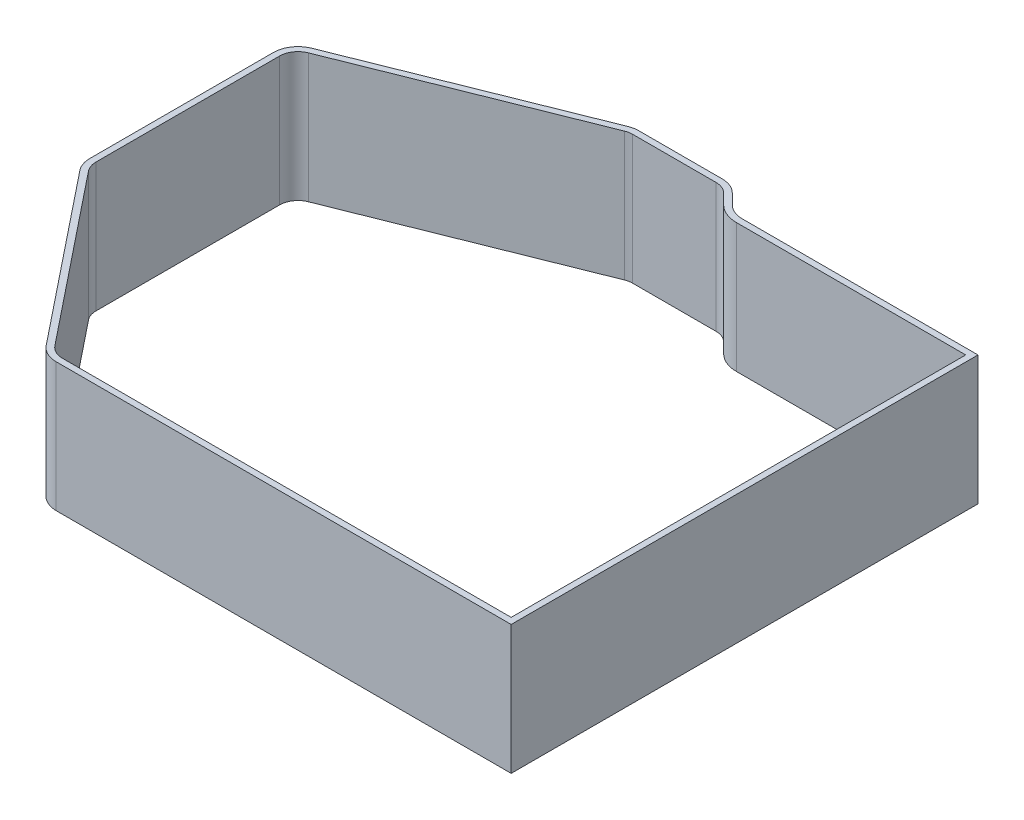
ISO-10303-21;
HEADER;
FILE_DESCRIPTION(('STEP AP214'),'2;1');
FILE_NAME('part.step','',(''),(''),'','','');
FILE_SCHEMA(('AUTOMOTIVE_DESIGN { 1 0 10303 214 1 1 1 1 }'));
ENDSEC;
DATA;
#1=APPLICATION_CONTEXT('core data for automotive mechanical design processes');
#2=APPLICATION_PROTOCOL_DEFINITION('international standard','automotive_design',2000,#1);
#3=PRODUCT_CONTEXT('',#1,'mechanical');
#4=PRODUCT('Part','Part','',(#3));
#5=PRODUCT_RELATED_PRODUCT_CATEGORY('part','',(#4));
#6=PRODUCT_DEFINITION_FORMATION('','',#4);
#7=PRODUCT_DEFINITION_CONTEXT('part definition',#1,'design');
#8=PRODUCT_DEFINITION('design','',#6,#7);
#9=PRODUCT_DEFINITION_SHAPE('','',#8);
#10=(LENGTH_UNIT() NAMED_UNIT(*) SI_UNIT(.MILLI.,.METRE.));
#11=(NAMED_UNIT(*) PLANE_ANGLE_UNIT() SI_UNIT($,.RADIAN.));
#12=(NAMED_UNIT(*) SI_UNIT($,.STERADIAN.) SOLID_ANGLE_UNIT());
#13=UNCERTAINTY_MEASURE_WITH_UNIT(LENGTH_MEASURE(1.E-05),#10,'distance_accuracy_value','');
#14=(GEOMETRIC_REPRESENTATION_CONTEXT(3) GLOBAL_UNCERTAINTY_ASSIGNED_CONTEXT((#13)) GLOBAL_UNIT_ASSIGNED_CONTEXT((#10,
#11,#12)) REPRESENTATION_CONTEXT('',''));
#15=CARTESIAN_POINT('',(0.,0.,0.));
#16=DIRECTION('',(0.,0.,1.));
#17=DIRECTION('',(1.,0.,0.));
#18=AXIS2_PLACEMENT_3D('',#15,#16,#17);
#19=CARTESIAN_POINT('',(1564.01878353652,2112.02129953211,42.7287277412105));
#20=DIRECTION('',(0.,1.,0.));
#21=DIRECTION('',(-1.,0.,0.));
#22=AXIS2_PLACEMENT_3D('',#19,#20,#21);
#23=PLANE('',#22);
#24=CARTESIAN_POINT('',(1564.01878353652,2112.02129953211,42.7287277412105));
#25=DIRECTION('',(0.,1.,0.));
#26=DIRECTION('',(-1.,0.,0.));
#27=AXIS2_PLACEMENT_3D('',#24,#25,#26);
#28=CIRCLE('',#27,1.99999999999854);
#29=CARTESIAN_POINT('',(1562.60456997414,2112.02129953211,44.142941303582));
#30=VERTEX_POINT('',#29);
#31=CARTESIAN_POINT('',(1564.01878353652,2112.02129953211,44.728727741209));
#32=VERTEX_POINT('',#31);
#33=EDGE_CURVE('E410',#30,#32,#28,.T.);
#34=ORIENTED_EDGE('',*,*,#33,.F.);
#35=DIRECTION('',(0.707106781186586,0.,0.707106781186509));
#36=VECTOR('',#35,1.);
#37=CARTESIAN_POINT('',(1561.7761428494,2112.02129953211,43.3145141788359));
#38=LINE('',#37,#36);
#39=CARTESIAN_POINT('',(1561.7761428494,2112.02129953211,43.3145141788358));
#40=VERTEX_POINT('',#39);
#41=EDGE_CURVE('E540',#40,#30,#38,.T.);
#42=ORIENTED_EDGE('',*,*,#41,.F.);
#43=CARTESIAN_POINT('',(1560.36192928702,2112.02129953211,44.7287277412084));
#44=DIRECTION('',(0.,1.,0.));
#45=DIRECTION('',(-1.,0.,0.));
#46=AXIS2_PLACEMENT_3D('',#43,#44,#45);
#47=CIRCLE('',#46,1.99999999999944);
#48=CARTESIAN_POINT('',(1560.36192928702,2112.02129953211,42.7287277412089));
#49=VERTEX_POINT('',#48);
#50=EDGE_CURVE('E414',#40,#49,#47,.T.);
#51=ORIENTED_EDGE('',*,*,#50,.T.);
#52=DIRECTION('',(1.,0.,0.));
#53=VECTOR('',#52,1.);
#54=CARTESIAN_POINT('',(1553.5755212189,2112.02129953211,42.7287277412089));
#55=LINE('',#54,#53);
#56=CARTESIAN_POINT('',(1553.5755212189,2112.02129953211,42.7287277412089));
#57=VERTEX_POINT('',#56);
#58=EDGE_CURVE('E565',#57,#49,#55,.T.);
#59=ORIENTED_EDGE('',*,*,#58,.F.);
#60=CARTESIAN_POINT('',(1553.5755212189,2112.02129953211,44.7287277412074));
#61=DIRECTION('',(0.,-1.,0.));
#62=DIRECTION('',(1.,0.,0.));
#63=AXIS2_PLACEMENT_3D('',#60,#61,#62);
#64=CIRCLE('',#63,1.99999999999848);
#65=CARTESIAN_POINT('',(1552.8327398662,2112.02129953211,42.8717743594383));
#66=VERTEX_POINT('',#65);
#67=EDGE_CURVE('E570',#66,#57,#64,.T.);
#68=ORIENTED_EDGE('',*,*,#67,.F.);
#69=DIRECTION('',(0.928476690885266,0.,-0.371390676354086));
#70=VECTOR('',#69,1.);
#71=CARTESIAN_POINT('',(1534.44757505906,2112.02129953211,50.2258402822917));
#72=LINE('',#71,#70);
#73=CARTESIAN_POINT('',(1534.44757505906,2112.02129953211,50.2258402822917));
#74=VERTEX_POINT('',#73);
#75=EDGE_CURVE('E575',#74,#66,#72,.T.);
#76=ORIENTED_EDGE('',*,*,#75,.F.);
#77=CARTESIAN_POINT('',(1535.19035641177,2112.02129953211,52.0827936640629));
#78=DIRECTION('',(0.,-1.,0.));
#79=DIRECTION('',(1.,0.,0.));
#80=AXIS2_PLACEMENT_3D('',#77,#78,#79);
#81=CIRCLE('',#80,2.00000000000108);
#82=CARTESIAN_POINT('',(1533.19035641177,2112.02129953211,52.0827936640623));
#83=VERTEX_POINT('',#82);
#84=EDGE_CURVE('E580',#83,#74,#81,.T.);
#85=ORIENTED_EDGE('',*,*,#84,.F.);
#86=DIRECTION('',(0.,0.,-1.));
#87=VECTOR('',#86,1.);
#88=CARTESIAN_POINT('',(1533.19035641177,2112.02129953211,67.027165622492));
#89=LINE('',#88,#87);
#90=CARTESIAN_POINT('',(1533.19035641177,2112.02129953211,67.027165622492));
#91=VERTEX_POINT('',#90);
#92=EDGE_CURVE('E585',#91,#83,#89,.T.);
#93=ORIENTED_EDGE('',*,*,#92,.F.);
#94=CARTESIAN_POINT('',(1535.19035641177,2112.02129953211,67.0271656224922));
#95=DIRECTION('',(0.,-1.,0.));
#96=DIRECTION('',(1.,0.,0.));
#97=AXIS2_PLACEMENT_3D('',#94,#95,#96);
#98=CIRCLE('',#97,1.99999999999956);
#99=CARTESIAN_POINT('',(1533.62861879288,2112.02129953211,68.2765557176009));
#100=VERTEX_POINT('',#99);
#101=EDGE_CURVE('E590',#100,#91,#98,.T.);
#102=ORIENTED_EDGE('',*,*,#101,.F.);
#103=DIRECTION('',(-0.624695047554412,0.,-0.780868809443041));
#104=VECTOR('',#103,1.);
#105=CARTESIAN_POINT('',(1544.58986848786,2112.02129953211,81.9781178363175));
#106=LINE('',#105,#104);
#107=CARTESIAN_POINT('',(1544.58986848786,2112.02129953211,81.9781178363175));
#108=VERTEX_POINT('',#107);
#109=EDGE_CURVE('E595',#108,#100,#106,.T.);
#110=ORIENTED_EDGE('',*,*,#109,.F.);
#111=CARTESIAN_POINT('',(1546.15160610674,2112.02129953211,80.7287277412086));
#112=DIRECTION('',(0.,-1.,0.));
#113=DIRECTION('',(1.,0.,0.));
#114=AXIS2_PLACEMENT_3D('',#111,#112,#113);
#115=CIRCLE('',#114,2.00000000000006);
#116=CARTESIAN_POINT('',(1546.15160610674,2112.02129953211,82.7287277412087));
#117=VERTEX_POINT('',#116);
#118=EDGE_CURVE('E600',#117,#108,#115,.T.);
#119=ORIENTED_EDGE('',*,*,#118,.F.);
#120=DIRECTION('',(-1.,0.,0.));
#121=VECTOR('',#120,1.);
#122=CARTESIAN_POINT('',(1583.19035641177,2112.02129953211,82.7287277412096));
#123=LINE('',#122,#121);
#124=CARTESIAN_POINT('',(1583.19035641177,2112.02129953211,82.7287277412096));
#125=VERTEX_POINT('',#124);
#126=EDGE_CURVE('E605',#125,#117,#123,.T.);
#127=ORIENTED_EDGE('',*,*,#126,.F.);
#128=DIRECTION('',(0.,0.,1.));
#129=VECTOR('',#128,1.);
#130=CARTESIAN_POINT('',(1583.19035641177,2112.02129953211,44.7287277412096));
#131=LINE('',#130,#129);
#132=CARTESIAN_POINT('',(1583.19035641177,2112.02129953211,44.7287277412096));
#133=VERTEX_POINT('',#132);
#134=EDGE_CURVE('E608',#133,#125,#131,.T.);
#135=ORIENTED_EDGE('',*,*,#134,.F.);
#136=DIRECTION('',(1.,0.,0.));
#137=VECTOR('',#136,1.);
#138=CARTESIAN_POINT('',(1564.01878353652,2112.02129953211,44.728727741209));
#139=LINE('',#138,#137);
#140=EDGE_CURVE('E541',#32,#133,#139,.T.);
#141=ORIENTED_EDGE('',*,*,#140,.F.);
#142=EDGE_LOOP('',(#34,#42,#51,#59,#68,#76,#85,#93,#102,#110,#119,#127,#135,#141));
#143=FACE_BOUND('',#142,.T.);
#144=DIRECTION('',(1.,0.,0.));
#145=VECTOR('',#144,1.);
#146=CARTESIAN_POINT('',(1.87587452291795E-11,2112.02129953212,43.2287277412089));
#147=LINE('',#146,#145);
#148=CARTESIAN_POINT('',(1553.5755212189,2112.02129953211,43.2287277412089));
#149=VERTEX_POINT('',#148);
#150=CARTESIAN_POINT('',(1560.36192928702,2112.02129953211,43.2287277412089));
#151=VERTEX_POINT('',#150);
#152=EDGE_CURVE('E340',#149,#151,#147,.T.);
#153=ORIENTED_EDGE('',*,*,#152,.T.);
#154=CARTESIAN_POINT('',(1560.36192928702,2112.02129953211,44.7287277412084));
#155=DIRECTION('',(0.,-1.,0.));
#156=DIRECTION('',(1.,0.,0.));
#157=AXIS2_PLACEMENT_3D('',#154,#155,#156);
#158=CIRCLE('',#157,1.49999999999952);
#159=CARTESIAN_POINT('',(1561.4225894588,2112.02129953211,43.6680675694292));
#160=VERTEX_POINT('',#159);
#161=EDGE_CURVE('E126',#160,#151,#158,.F.);
#162=ORIENTED_EDGE('',*,*,#161,.F.);
#163=DIRECTION('',(0.707106781186696,0.,0.7071067811864));
#164=VECTOR('',#163,1.);
#165=CARTESIAN_POINT('',(758.877260944369,2112.02129953212,-758.877260944668));
#166=LINE('',#165,#164);
#167=CARTESIAN_POINT('',(1562.25101658355,2112.02129953211,44.4964946941746));
#168=VERTEX_POINT('',#167);
#169=EDGE_CURVE('E333',#160,#168,#166,.T.);
#170=ORIENTED_EDGE('',*,*,#169,.T.);
#171=CARTESIAN_POINT('',(1564.01878353652,2112.02129953211,42.7287277412105));
#172=DIRECTION('',(0.,-1.,0.));
#173=DIRECTION('',(1.,0.,0.));
#174=AXIS2_PLACEMENT_3D('',#171,#172,#173);
#175=CIRCLE('',#174,2.49999999999828);
#176=CARTESIAN_POINT('',(1564.01878353652,2112.02129953211,45.2287277412088));
#177=VERTEX_POINT('',#176);
#178=EDGE_CURVE('E339',#168,#177,#175,.F.);
#179=ORIENTED_EDGE('',*,*,#178,.T.);
#180=DIRECTION('',(1.,0.,0.));
#181=VECTOR('',#180,1.);
#182=CARTESIAN_POINT('',(1.87587452291795E-11,2112.02129953212,45.2287277412088));
#183=LINE('',#182,#181);
#184=CARTESIAN_POINT('',(1582.69035641177,2112.02129953211,45.2287277412088));
#185=VERTEX_POINT('',#184);
#186=EDGE_CURVE('E451',#177,#185,#183,.T.);
#187=ORIENTED_EDGE('',*,*,#186,.T.);
#188=DIRECTION('',(0.,0.,1.));
#189=VECTOR('',#188,1.);
#190=CARTESIAN_POINT('',(1582.69035641177,2112.02129953211,0.));
#191=LINE('',#190,#189);
#192=CARTESIAN_POINT('',(1582.69035641177,2112.02129953211,82.2287277412087));
#193=VERTEX_POINT('',#192);
#194=EDGE_CURVE('E447',#185,#193,#191,.T.);
#195=ORIENTED_EDGE('',*,*,#194,.T.);
#196=DIRECTION('',(-1.,0.,0.));
#197=VECTOR('',#196,1.);
#198=CARTESIAN_POINT('',(1.87587452291795E-11,2112.02129953212,82.2287277412087));
#199=LINE('',#198,#197);
#200=CARTESIAN_POINT('',(1546.15160610674,2112.02129953211,82.2287277412087));
#201=VERTEX_POINT('',#200);
#202=EDGE_CURVE('E443',#193,#201,#199,.T.);
#203=ORIENTED_EDGE('',*,*,#202,.T.);
#204=CARTESIAN_POINT('',(1546.15160610674,2112.02129953211,80.7287277412086));
#205=DIRECTION('',(0.,-1.,0.));
#206=DIRECTION('',(1.,0.,0.));
#207=AXIS2_PLACEMENT_3D('',#204,#205,#206);
#208=CIRCLE('',#207,1.5000000000001);
#209=CARTESIAN_POINT('',(1544.98030289258,2112.02129953211,81.6657703125404));
#210=VERTEX_POINT('',#209);
#211=EDGE_CURVE('E439',#201,#210,#208,.T.);
#212=ORIENTED_EDGE('',*,*,#211,.T.);
#213=DIRECTION('',(-0.624695047554411,0.,-0.780868809443041));
#214=VECTOR('',#213,1.);
#215=CARTESIAN_POINT('',(902.224199172316,2112.02129953211,-721.779359337813));
#216=LINE('',#215,#214);
#217=CARTESIAN_POINT('',(1534.0190531976,2112.02129953211,67.9642081938237));
#218=VERTEX_POINT('',#217);
#219=EDGE_CURVE('E435',#210,#218,#216,.T.);
#220=ORIENTED_EDGE('',*,*,#219,.T.);
#221=CARTESIAN_POINT('',(1535.19035641177,2112.02129953211,67.0271656224922));
#222=DIRECTION('',(0.,-1.,0.));
#223=DIRECTION('',(1.,0.,0.));
#224=AXIS2_PLACEMENT_3D('',#221,#222,#223);
#225=CIRCLE('',#224,1.49999999999962);
#226=CARTESIAN_POINT('',(1533.69035641177,2112.02129953211,67.0271656224921));
#227=VERTEX_POINT('',#226);
#228=EDGE_CURVE('E431',#218,#227,#225,.T.);
#229=ORIENTED_EDGE('',*,*,#228,.T.);
#230=DIRECTION('',(0.,0.,-1.));
#231=VECTOR('',#230,1.);
#232=CARTESIAN_POINT('',(1533.69035641177,2112.02129953211,0.));
#233=LINE('',#232,#231);
#234=CARTESIAN_POINT('',(1533.69035641177,2112.02129953211,52.0827936640623));
#235=VERTEX_POINT('',#234);
#236=EDGE_CURVE('E427',#227,#235,#233,.T.);
#237=ORIENTED_EDGE('',*,*,#236,.T.);
#238=CARTESIAN_POINT('',(1535.19035641177,2112.02129953211,52.0827936640629));
#239=DIRECTION('',(0.,-1.,0.));
#240=DIRECTION('',(1.,0.,0.));
#241=AXIS2_PLACEMENT_3D('',#238,#239,#240);
#242=CIRCLE('',#241,1.50000000000154);
#243=CARTESIAN_POINT('',(1534.63327039724,2112.02129953211,50.6900786277338));
#244=VERTEX_POINT('',#243);
#245=EDGE_CURVE('E423',#235,#244,#242,.T.);
#246=ORIENTED_EDGE('',*,*,#245,.T.);
#247=DIRECTION('',(0.928476690885276,0.,-0.371390676354064));
#248=VECTOR('',#247,1.);
#249=CARTESIAN_POINT('',(229.152891995358,2112.02129953212,572.88222998842));
#250=LINE('',#249,#248);
#251=CARTESIAN_POINT('',(1553.01843520437,2112.02129953211,43.3360127048809));
#252=VERTEX_POINT('',#251);
#253=EDGE_CURVE('E419',#244,#252,#250,.T.);
#254=ORIENTED_EDGE('',*,*,#253,.T.);
#255=CARTESIAN_POINT('',(1553.5755212189,2112.02129953211,44.7287277412074));
#256=DIRECTION('',(0.,-1.,0.));
#257=DIRECTION('',(1.,0.,0.));
#258=AXIS2_PLACEMENT_3D('',#255,#256,#257);
#259=CIRCLE('',#258,1.49999999999845);
#260=EDGE_CURVE('E415',#252,#149,#259,.T.);
#261=ORIENTED_EDGE('',*,*,#260,.T.);
#262=EDGE_LOOP('',(#153,#162,#170,#179,#187,#195,#203,#212,#220,#229,#237,#246,#254,#261));
#263=FACE_BOUND('',#262,.T.);
#264=ADVANCED_FACE('F123',(#143,#263),#23,.T.);
#265=CARTESIAN_POINT('',(1564.01878353652,2101.52129953211,42.7287277412105));
#266=DIRECTION('',(0.,1.,0.));
#267=DIRECTION('',(-1.,0.,0.));
#268=AXIS2_PLACEMENT_3D('',#265,#266,#267);
#269=PLANE('',#268);
#270=CARTESIAN_POINT('',(1564.01878353652,2101.52129953211,42.7287277412105));
#271=DIRECTION('',(0.,1.,0.));
#272=DIRECTION('',(-1.,0.,0.));
#273=AXIS2_PLACEMENT_3D('',#270,#271,#272);
#274=CIRCLE('',#273,1.99999999999854);
#275=CARTESIAN_POINT('',(1562.60456997414,2101.52129953211,44.142941303582));
#276=VERTEX_POINT('',#275);
#277=CARTESIAN_POINT('',(1564.01878353652,2101.52129953211,44.728727741209));
#278=VERTEX_POINT('',#277);
#279=EDGE_CURVE('E418',#276,#278,#274,.T.);
#280=ORIENTED_EDGE('',*,*,#279,.T.);
#281=DIRECTION('',(1.,0.,0.));
#282=VECTOR('',#281,1.);
#283=CARTESIAN_POINT('',(1564.01878353652,2101.52129953211,44.728727741209));
#284=LINE('',#283,#282);
#285=CARTESIAN_POINT('',(1583.19035641177,2101.52129953211,44.7287277412096));
#286=VERTEX_POINT('',#285);
#287=EDGE_CURVE('E683',#278,#286,#284,.T.);
#288=ORIENTED_EDGE('',*,*,#287,.T.);
#289=DIRECTION('',(0.,0.,1.));
#290=VECTOR('',#289,1.);
#291=CARTESIAN_POINT('',(1583.19035641177,2101.52129953211,44.7287277412096));
#292=LINE('',#291,#290);
#293=CARTESIAN_POINT('',(1583.19035641177,2101.52129953211,82.7287277412096));
#294=VERTEX_POINT('',#293);
#295=EDGE_CURVE('E680',#286,#294,#292,.T.);
#296=ORIENTED_EDGE('',*,*,#295,.T.);
#297=DIRECTION('',(-1.,0.,0.));
#298=VECTOR('',#297,1.);
#299=CARTESIAN_POINT('',(1583.19035641177,2101.52129953211,82.7287277412096));
#300=LINE('',#299,#298);
#301=CARTESIAN_POINT('',(1546.15160610674,2101.52129953211,82.7287277412087));
#302=VERTEX_POINT('',#301);
#303=EDGE_CURVE('E676',#294,#302,#300,.T.);
#304=ORIENTED_EDGE('',*,*,#303,.T.);
#305=CARTESIAN_POINT('',(1546.15160610674,2101.52129953211,80.7287277412086));
#306=DIRECTION('',(0.,-1.,0.));
#307=DIRECTION('',(1.,0.,0.));
#308=AXIS2_PLACEMENT_3D('',#305,#306,#307);
#309=CIRCLE('',#308,2.00000000000006);
#310=CARTESIAN_POINT('',(1544.58986848786,2101.52129953211,81.9781178363175));
#311=VERTEX_POINT('',#310);
#312=EDGE_CURVE('E672',#302,#311,#309,.T.);
#313=ORIENTED_EDGE('',*,*,#312,.T.);
#314=DIRECTION('',(-0.624695047554412,0.,-0.780868809443041));
#315=VECTOR('',#314,1.);
#316=CARTESIAN_POINT('',(1544.58986848786,2101.52129953211,81.9781178363175));
#317=LINE('',#316,#315);
#318=CARTESIAN_POINT('',(1533.62861879288,2101.52129953211,68.2765557176009));
#319=VERTEX_POINT('',#318);
#320=EDGE_CURVE('E668',#311,#319,#317,.T.);
#321=ORIENTED_EDGE('',*,*,#320,.T.);
#322=CARTESIAN_POINT('',(1535.19035641177,2101.52129953211,67.0271656224922));
#323=DIRECTION('',(0.,-1.,0.));
#324=DIRECTION('',(1.,0.,0.));
#325=AXIS2_PLACEMENT_3D('',#322,#323,#324);
#326=CIRCLE('',#325,1.99999999999956);
#327=CARTESIAN_POINT('',(1533.19035641177,2101.52129953211,67.027165622492));
#328=VERTEX_POINT('',#327);
#329=EDGE_CURVE('E664',#319,#328,#326,.T.);
#330=ORIENTED_EDGE('',*,*,#329,.T.);
#331=DIRECTION('',(0.,0.,-1.));
#332=VECTOR('',#331,1.);
#333=CARTESIAN_POINT('',(1533.19035641177,2101.52129953211,67.027165622492));
#334=LINE('',#333,#332);
#335=CARTESIAN_POINT('',(1533.19035641177,2101.52129953211,52.0827936640623));
#336=VERTEX_POINT('',#335);
#337=EDGE_CURVE('E660',#328,#336,#334,.T.);
#338=ORIENTED_EDGE('',*,*,#337,.T.);
#339=CARTESIAN_POINT('',(1535.19035641177,2101.52129953211,52.0827936640629));
#340=DIRECTION('',(0.,-1.,0.));
#341=DIRECTION('',(1.,0.,0.));
#342=AXIS2_PLACEMENT_3D('',#339,#340,#341);
#343=CIRCLE('',#342,2.00000000000108);
#344=CARTESIAN_POINT('',(1534.44757505906,2101.52129953211,50.2258402822917));
#345=VERTEX_POINT('',#344);
#346=EDGE_CURVE('E656',#336,#345,#343,.T.);
#347=ORIENTED_EDGE('',*,*,#346,.T.);
#348=DIRECTION('',(0.928476690885266,0.,-0.371390676354086));
#349=VECTOR('',#348,1.);
#350=CARTESIAN_POINT('',(1534.44757505906,2101.52129953211,50.2258402822917));
#351=LINE('',#350,#349);
#352=CARTESIAN_POINT('',(1552.8327398662,2101.52129953211,42.8717743594383));
#353=VERTEX_POINT('',#352);
#354=EDGE_CURVE('E652',#345,#353,#351,.T.);
#355=ORIENTED_EDGE('',*,*,#354,.T.);
#356=CARTESIAN_POINT('',(1553.5755212189,2101.52129953211,44.7287277412074));
#357=DIRECTION('',(0.,-1.,0.));
#358=DIRECTION('',(1.,0.,0.));
#359=AXIS2_PLACEMENT_3D('',#356,#357,#358);
#360=CIRCLE('',#359,1.99999999999848);
#361=CARTESIAN_POINT('',(1553.5755212189,2101.52129953211,42.7287277412089));
#362=VERTEX_POINT('',#361);
#363=EDGE_CURVE('E648',#353,#362,#360,.T.);
#364=ORIENTED_EDGE('',*,*,#363,.T.);
#365=DIRECTION('',(1.,0.,0.));
#366=VECTOR('',#365,1.);
#367=CARTESIAN_POINT('',(1553.5755212189,2101.52129953211,42.7287277412089));
#368=LINE('',#367,#366);
#369=CARTESIAN_POINT('',(1560.36192928702,2101.52129953211,42.7287277412089));
#370=VERTEX_POINT('',#369);
#371=EDGE_CURVE('E641',#362,#370,#368,.T.);
#372=ORIENTED_EDGE('',*,*,#371,.T.);
#373=CARTESIAN_POINT('',(1560.36192928702,2101.52129953211,44.7287277412084));
#374=DIRECTION('',(0.,1.,0.));
#375=DIRECTION('',(-1.,0.,0.));
#376=AXIS2_PLACEMENT_3D('',#373,#374,#375);
#377=CIRCLE('',#376,1.99999999999944);
#378=CARTESIAN_POINT('',(1561.7761428494,2101.52129953211,43.3145141788358));
#379=VERTEX_POINT('',#378);
#380=EDGE_CURVE('E557',#379,#370,#377,.T.);
#381=ORIENTED_EDGE('',*,*,#380,.F.);
#382=DIRECTION('',(0.707106781186586,0.,0.707106781186509));
#383=VECTOR('',#382,1.);
#384=CARTESIAN_POINT('',(1561.7761428494,2101.52129953211,43.3145141788359));
#385=LINE('',#384,#383);
#386=EDGE_CURVE('E411',#379,#276,#385,.T.);
#387=ORIENTED_EDGE('',*,*,#386,.T.);
#388=EDGE_LOOP('',(#280,#288,#296,#304,#313,#321,#330,#338,#347,#355,#364,#372,#381,#387));
#389=FACE_BOUND('',#388,.T.);
#390=CARTESIAN_POINT('',(1560.36192928702,2101.52129953211,44.7287277412084));
#391=DIRECTION('',(0.,-1.,0.));
#392=DIRECTION('',(1.,0.,0.));
#393=AXIS2_PLACEMENT_3D('',#390,#391,#392);
#394=CIRCLE('',#393,1.49999999999952);
#395=CARTESIAN_POINT('',(1561.4225894588,2101.52129953211,43.6680675694293));
#396=VERTEX_POINT('',#395);
#397=CARTESIAN_POINT('',(1560.36192928702,2101.52129953211,43.2287277412089));
#398=VERTEX_POINT('',#397);
#399=EDGE_CURVE('E318',#396,#398,#394,.F.);
#400=ORIENTED_EDGE('',*,*,#399,.T.);
#401=DIRECTION('',(1.,0.,0.));
#402=VECTOR('',#401,1.);
#403=CARTESIAN_POINT('',(1.86854241210638E-11,2101.52129953212,43.2287277412089));
#404=LINE('',#403,#402);
#405=CARTESIAN_POINT('',(1553.5755212189,2101.52129953211,43.2287277412089));
#406=VERTEX_POINT('',#405);
#407=EDGE_CURVE('E347',#406,#398,#404,.T.);
#408=ORIENTED_EDGE('',*,*,#407,.F.);
#409=CARTESIAN_POINT('',(1553.5755212189,2101.52129953211,44.7287277412074));
#410=DIRECTION('',(0.,-1.,0.));
#411=DIRECTION('',(1.,0.,0.));
#412=AXIS2_PLACEMENT_3D('',#409,#410,#411);
#413=CIRCLE('',#412,1.49999999999845);
#414=CARTESIAN_POINT('',(1553.01843520437,2101.52129953211,43.3360127048809));
#415=VERTEX_POINT('',#414);
#416=EDGE_CURVE('E357',#415,#406,#413,.T.);
#417=ORIENTED_EDGE('',*,*,#416,.F.);
#418=DIRECTION('',(0.928476690885276,0.,-0.371390676354064));
#419=VECTOR('',#418,1.);
#420=CARTESIAN_POINT('',(229.152891995358,2101.52129953212,572.88222998842));
#421=LINE('',#420,#419);
#422=CARTESIAN_POINT('',(1534.63327039724,2101.52129953211,50.6900786277338));
#423=VERTEX_POINT('',#422);
#424=EDGE_CURVE('E361',#423,#415,#421,.T.);
#425=ORIENTED_EDGE('',*,*,#424,.F.);
#426=CARTESIAN_POINT('',(1535.19035641177,2101.52129953211,52.0827936640629));
#427=DIRECTION('',(0.,-1.,0.));
#428=DIRECTION('',(1.,0.,0.));
#429=AXIS2_PLACEMENT_3D('',#426,#427,#428);
#430=CIRCLE('',#429,1.50000000000154);
#431=CARTESIAN_POINT('',(1533.69035641177,2101.52129953211,52.0827936640623));
#432=VERTEX_POINT('',#431);
#433=EDGE_CURVE('E366',#432,#423,#430,.T.);
#434=ORIENTED_EDGE('',*,*,#433,.F.);
#435=DIRECTION('',(0.,0.,-1.));
#436=VECTOR('',#435,1.);
#437=CARTESIAN_POINT('',(1533.69035641177,2101.52129953211,0.));
#438=LINE('',#437,#436);
#439=CARTESIAN_POINT('',(1533.69035641177,2101.52129953211,67.0271656224921));
#440=VERTEX_POINT('',#439);
#441=EDGE_CURVE('E371',#440,#432,#438,.T.);
#442=ORIENTED_EDGE('',*,*,#441,.F.);
#443=CARTESIAN_POINT('',(1535.19035641177,2101.52129953211,67.0271656224922));
#444=DIRECTION('',(0.,-1.,0.));
#445=DIRECTION('',(1.,0.,0.));
#446=AXIS2_PLACEMENT_3D('',#443,#444,#445);
#447=CIRCLE('',#446,1.49999999999962);
#448=CARTESIAN_POINT('',(1534.0190531976,2101.52129953211,67.9642081938237));
#449=VERTEX_POINT('',#448);
#450=EDGE_CURVE('E376',#449,#440,#447,.T.);
#451=ORIENTED_EDGE('',*,*,#450,.F.);
#452=DIRECTION('',(-0.624695047554411,0.,-0.780868809443041));
#453=VECTOR('',#452,1.);
#454=CARTESIAN_POINT('',(902.224199172316,2101.52129953211,-721.779359337813));
#455=LINE('',#454,#453);
#456=CARTESIAN_POINT('',(1544.98030289258,2101.52129953211,81.6657703125404));
#457=VERTEX_POINT('',#456);
#458=EDGE_CURVE('E381',#457,#449,#455,.T.);
#459=ORIENTED_EDGE('',*,*,#458,.F.);
#460=CARTESIAN_POINT('',(1546.15160610674,2101.52129953211,80.7287277412086));
#461=DIRECTION('',(0.,-1.,0.));
#462=DIRECTION('',(1.,0.,0.));
#463=AXIS2_PLACEMENT_3D('',#460,#461,#462);
#464=CIRCLE('',#463,1.5000000000001);
#465=CARTESIAN_POINT('',(1546.15160610674,2101.52129953211,82.2287277412087));
#466=VERTEX_POINT('',#465);
#467=EDGE_CURVE('E386',#466,#457,#464,.T.);
#468=ORIENTED_EDGE('',*,*,#467,.F.);
#469=DIRECTION('',(-1.,0.,0.));
#470=VECTOR('',#469,1.);
#471=CARTESIAN_POINT('',(1.86854241210638E-11,2101.52129953212,82.2287277412087));
#472=LINE('',#471,#470);
#473=CARTESIAN_POINT('',(1582.69035641177,2101.52129953211,82.2287277412087));
#474=VERTEX_POINT('',#473);
#475=EDGE_CURVE('E391',#474,#466,#472,.T.);
#476=ORIENTED_EDGE('',*,*,#475,.F.);
#477=DIRECTION('',(0.,0.,1.));
#478=VECTOR('',#477,1.);
#479=CARTESIAN_POINT('',(1582.69035641177,2101.52129953211,0.));
#480=LINE('',#479,#478);
#481=CARTESIAN_POINT('',(1582.69035641177,2101.52129953211,45.2287277412088));
#482=VERTEX_POINT('',#481);
#483=EDGE_CURVE('E396',#482,#474,#480,.T.);
#484=ORIENTED_EDGE('',*,*,#483,.F.);
#485=DIRECTION('',(1.,0.,0.));
#486=VECTOR('',#485,1.);
#487=CARTESIAN_POINT('',(1.86854241210638E-11,2101.52129953212,45.2287277412088));
#488=LINE('',#487,#486);
#489=CARTESIAN_POINT('',(1564.01878353652,2101.52129953211,45.2287277412088));
#490=VERTEX_POINT('',#489);
#491=EDGE_CURVE('E400',#490,#482,#488,.T.);
#492=ORIENTED_EDGE('',*,*,#491,.F.);
#493=CARTESIAN_POINT('',(1564.01878353652,2101.52129953211,42.7287277412105));
#494=DIRECTION('',(0.,-1.,0.));
#495=DIRECTION('',(1.,0.,0.));
#496=AXIS2_PLACEMENT_3D('',#493,#494,#495);
#497=CIRCLE('',#496,2.49999999999828);
#498=CARTESIAN_POINT('',(1562.25101658355,2101.52129953211,44.4964946941748));
#499=VERTEX_POINT('',#498);
#500=EDGE_CURVE('E328',#499,#490,#497,.F.);
#501=ORIENTED_EDGE('',*,*,#500,.F.);
#502=DIRECTION('',(0.707106781186696,0.,0.7071067811864));
#503=VECTOR('',#502,1.);
#504=CARTESIAN_POINT('',(758.877260944369,2101.52129953212,-758.877260944668));
#505=LINE('',#504,#503);
#506=EDGE_CURVE('E329',#396,#499,#505,.T.);
#507=ORIENTED_EDGE('',*,*,#506,.F.);
#508=EDGE_LOOP('',(#400,#408,#417,#425,#434,#442,#451,#459,#468,#476,#484,#492,#501,#507));
#509=FACE_BOUND('',#508,.T.);
#510=ADVANCED_FACE('F462',(#389,#509),#269,.F.);
#511=CARTESIAN_POINT('',(1564.01878353652,2112.02129953211,42.7287277412105));
#512=DIRECTION('',(0.,-1.,0.));
#513=DIRECTION('',(1.,0.,0.));
#514=AXIS2_PLACEMENT_3D('',#511,#512,#513);
#515=CYLINDRICAL_SURFACE('',#514,1.99999999999854);
#516=ORIENTED_EDGE('',*,*,#279,.F.);
#517=DIRECTION('',(0.,-1.,0.));
#518=VECTOR('',#517,1.);
#519=CARTESIAN_POINT('',(1562.60456997414,2112.02129953211,44.142941303582));
#520=LINE('',#519,#518);
#521=EDGE_CURVE('E549',#30,#276,#520,.T.);
#522=ORIENTED_EDGE('',*,*,#521,.F.);
#523=ORIENTED_EDGE('',*,*,#33,.T.);
#524=DIRECTION('',(0.,-1.,0.));
#525=VECTOR('',#524,1.);
#526=CARTESIAN_POINT('',(1564.01878353652,2112.02129953211,44.728727741209));
#527=LINE('',#526,#525);
#528=EDGE_CURVE('E544',#32,#278,#527,.T.);
#529=ORIENTED_EDGE('',*,*,#528,.T.);
#530=EDGE_LOOP('',(#516,#522,#523,#529));
#531=FACE_BOUND('',#530,.T.);
#532=ADVANCED_FACE('F533',(#531),#515,.F.);
#533=CARTESIAN_POINT('',(1561.7761428494,2112.02129953211,43.3145141788359));
#534=DIRECTION('',(0.707106781186509,0.,-0.707106781186586));
#535=DIRECTION('',(-0.707106781186586,0.,-0.707106781186509));
#536=AXIS2_PLACEMENT_3D('',#533,#534,#535);
#537=PLANE('',#536);
#538=ORIENTED_EDGE('',*,*,#386,.F.);
#539=DIRECTION('',(0.,-1.,0.));
#540=VECTOR('',#539,1.);
#541=CARTESIAN_POINT('',(1561.7761428494,2112.02129953211,43.3145141788358));
#542=LINE('',#541,#540);
#543=EDGE_CURVE('E551',#40,#379,#542,.T.);
#544=ORIENTED_EDGE('',*,*,#543,.F.);
#545=ORIENTED_EDGE('',*,*,#41,.T.);
#546=ORIENTED_EDGE('',*,*,#521,.T.);
#547=EDGE_LOOP('',(#538,#544,#545,#546));
#548=FACE_BOUND('',#547,.T.);
#549=ADVANCED_FACE('F548',(#548),#537,.T.);
#550=CARTESIAN_POINT('',(1560.36192928702,2112.02129953211,44.7287277412084));
#551=DIRECTION('',(0.,-1.,0.));
#552=DIRECTION('',(1.,0.,0.));
#553=AXIS2_PLACEMENT_3D('',#550,#551,#552);
#554=CYLINDRICAL_SURFACE('',#553,1.99999999999944);
#555=ORIENTED_EDGE('',*,*,#380,.T.);
#556=DIRECTION('',(0.,-1.,0.));
#557=VECTOR('',#556,1.);
#558=CARTESIAN_POINT('',(1560.36192928702,2112.02129953211,42.7287277412089));
#559=LINE('',#558,#557);
#560=EDGE_CURVE('E569',#49,#370,#559,.T.);
#561=ORIENTED_EDGE('',*,*,#560,.F.);
#562=ORIENTED_EDGE('',*,*,#50,.F.);
#563=ORIENTED_EDGE('',*,*,#543,.T.);
#564=EDGE_LOOP('',(#555,#561,#562,#563));
#565=FACE_BOUND('',#564,.T.);
#566=ADVANCED_FACE('F735',(#565),#554,.T.);
#567=CARTESIAN_POINT('',(1553.5755212189,2112.02129953211,42.7287277412089));
#568=DIRECTION('',(0.,0.,-1.));
#569=DIRECTION('',(-1.,0.,0.));
#570=AXIS2_PLACEMENT_3D('',#567,#568,#569);
#571=PLANE('',#570);
#572=ORIENTED_EDGE('',*,*,#371,.F.);
#573=DIRECTION('',(0.,-1.,0.));
#574=VECTOR('',#573,1.);
#575=CARTESIAN_POINT('',(1553.5755212189,2112.02129953211,42.7287277412089));
#576=LINE('',#575,#574);
#577=EDGE_CURVE('E574',#57,#362,#576,.T.);
#578=ORIENTED_EDGE('',*,*,#577,.F.);
#579=ORIENTED_EDGE('',*,*,#58,.T.);
#580=ORIENTED_EDGE('',*,*,#560,.T.);
#581=EDGE_LOOP('',(#572,#578,#579,#580));
#582=FACE_BOUND('',#581,.T.);
#583=ADVANCED_FACE('F731',(#582),#571,.T.);
#584=CARTESIAN_POINT('',(1553.5755212189,2112.02129953211,44.7287277412074));
#585=DIRECTION('',(0.,-1.,0.));
#586=DIRECTION('',(1.,0.,0.));
#587=AXIS2_PLACEMENT_3D('',#584,#585,#586);
#588=CYLINDRICAL_SURFACE('',#587,1.99999999999848);
#589=ORIENTED_EDGE('',*,*,#363,.F.);
#590=DIRECTION('',(0.,-1.,0.));
#591=VECTOR('',#590,1.);
#592=CARTESIAN_POINT('',(1552.8327398662,2112.02129953211,42.8717743594383));
#593=LINE('',#592,#591);
#594=EDGE_CURVE('E579',#66,#353,#593,.T.);
#595=ORIENTED_EDGE('',*,*,#594,.F.);
#596=ORIENTED_EDGE('',*,*,#67,.T.);
#597=ORIENTED_EDGE('',*,*,#577,.T.);
#598=EDGE_LOOP('',(#589,#595,#596,#597));
#599=FACE_BOUND('',#598,.T.);
#600=ADVANCED_FACE('F727',(#599),#588,.T.);
#601=CARTESIAN_POINT('',(1534.44757505906,2112.02129953211,50.2258402822917));
#602=DIRECTION('',(-0.371390676354086,0.,-0.928476690885267));
#603=DIRECTION('',(-0.928476690885267,0.,0.371390676354086));
#604=AXIS2_PLACEMENT_3D('',#601,#602,#603);
#605=PLANE('',#604);
#606=ORIENTED_EDGE('',*,*,#354,.F.);
#607=DIRECTION('',(0.,-1.,0.));
#608=VECTOR('',#607,1.);
#609=CARTESIAN_POINT('',(1534.44757505906,2112.02129953211,50.2258402822917));
#610=LINE('',#609,#608);
#611=EDGE_CURVE('E584',#74,#345,#610,.T.);
#612=ORIENTED_EDGE('',*,*,#611,.F.);
#613=ORIENTED_EDGE('',*,*,#75,.T.);
#614=ORIENTED_EDGE('',*,*,#594,.T.);
#615=EDGE_LOOP('',(#606,#612,#613,#614));
#616=FACE_BOUND('',#615,.T.);
#617=ADVANCED_FACE('F723',(#616),#605,.T.);
#618=CARTESIAN_POINT('',(1535.19035641177,2112.02129953211,52.0827936640629));
#619=DIRECTION('',(0.,-1.,0.));
#620=DIRECTION('',(1.,0.,0.));
#621=AXIS2_PLACEMENT_3D('',#618,#619,#620);
#622=CYLINDRICAL_SURFACE('',#621,2.00000000000108);
#623=ORIENTED_EDGE('',*,*,#346,.F.);
#624=DIRECTION('',(0.,-1.,0.));
#625=VECTOR('',#624,1.);
#626=CARTESIAN_POINT('',(1533.19035641177,2112.02129953211,52.0827936640623));
#627=LINE('',#626,#625);
#628=EDGE_CURVE('E589',#83,#336,#627,.T.);
#629=ORIENTED_EDGE('',*,*,#628,.F.);
#630=ORIENTED_EDGE('',*,*,#84,.T.);
#631=ORIENTED_EDGE('',*,*,#611,.T.);
#632=EDGE_LOOP('',(#623,#629,#630,#631));
#633=FACE_BOUND('',#632,.T.);
#634=ADVANCED_FACE('F719',(#633),#622,.T.);
#635=CARTESIAN_POINT('',(1533.19035641177,2112.02129953211,67.027165622492));
#636=DIRECTION('',(-1.,0.,0.));
#637=DIRECTION('',(0.,0.,1.));
#638=AXIS2_PLACEMENT_3D('',#635,#636,#637);
#639=PLANE('',#638);
#640=ORIENTED_EDGE('',*,*,#337,.F.);
#641=DIRECTION('',(0.,-1.,0.));
#642=VECTOR('',#641,1.);
#643=CARTESIAN_POINT('',(1533.19035641177,2112.02129953211,67.027165622492));
#644=LINE('',#643,#642);
#645=EDGE_CURVE('E594',#91,#328,#644,.T.);
#646=ORIENTED_EDGE('',*,*,#645,.F.);
#647=ORIENTED_EDGE('',*,*,#92,.T.);
#648=ORIENTED_EDGE('',*,*,#628,.T.);
#649=EDGE_LOOP('',(#640,#646,#647,#648));
#650=FACE_BOUND('',#649,.T.);
#651=ADVANCED_FACE('F715',(#650),#639,.T.);
#652=CARTESIAN_POINT('',(1535.19035641177,2112.02129953211,67.0271656224922));
#653=DIRECTION('',(0.,-1.,0.));
#654=DIRECTION('',(1.,0.,0.));
#655=AXIS2_PLACEMENT_3D('',#652,#653,#654);
#656=CYLINDRICAL_SURFACE('',#655,1.99999999999956);
#657=ORIENTED_EDGE('',*,*,#329,.F.);
#658=DIRECTION('',(0.,-1.,0.));
#659=VECTOR('',#658,1.);
#660=CARTESIAN_POINT('',(1533.62861879288,2112.02129953211,68.2765557176009));
#661=LINE('',#660,#659);
#662=EDGE_CURVE('E599',#100,#319,#661,.T.);
#663=ORIENTED_EDGE('',*,*,#662,.F.);
#664=ORIENTED_EDGE('',*,*,#101,.T.);
#665=ORIENTED_EDGE('',*,*,#645,.T.);
#666=EDGE_LOOP('',(#657,#663,#664,#665));
#667=FACE_BOUND('',#666,.T.);
#668=ADVANCED_FACE('F711',(#667),#656,.T.);
#669=CARTESIAN_POINT('',(1544.58986848786,2112.02129953211,81.9781178363175));
#670=DIRECTION('',(-0.780868809443041,0.,0.624695047554412));
#671=DIRECTION('',(0.624695047554412,0.,0.780868809443041));
#672=AXIS2_PLACEMENT_3D('',#669,#670,#671);
#673=PLANE('',#672);
#674=ORIENTED_EDGE('',*,*,#320,.F.);
#675=DIRECTION('',(0.,-1.,0.));
#676=VECTOR('',#675,1.);
#677=CARTESIAN_POINT('',(1544.58986848786,2112.02129953211,81.9781178363175));
#678=LINE('',#677,#676);
#679=EDGE_CURVE('E604',#108,#311,#678,.T.);
#680=ORIENTED_EDGE('',*,*,#679,.F.);
#681=ORIENTED_EDGE('',*,*,#109,.T.);
#682=ORIENTED_EDGE('',*,*,#662,.T.);
#683=EDGE_LOOP('',(#674,#680,#681,#682));
#684=FACE_BOUND('',#683,.T.);
#685=ADVANCED_FACE('F707',(#684),#673,.T.);
#686=CARTESIAN_POINT('',(1546.15160610674,2112.02129953211,80.7287277412086));
#687=DIRECTION('',(0.,-1.,0.));
#688=DIRECTION('',(1.,0.,0.));
#689=AXIS2_PLACEMENT_3D('',#686,#687,#688);
#690=CYLINDRICAL_SURFACE('',#689,2.00000000000006);
#691=ORIENTED_EDGE('',*,*,#312,.F.);
#692=DIRECTION('',(0.,-1.,0.));
#693=VECTOR('',#692,1.);
#694=CARTESIAN_POINT('',(1546.15160610674,2112.02129953211,82.7287277412087));
#695=LINE('',#694,#693);
#696=EDGE_CURVE('E293',#117,#302,#695,.T.);
#697=ORIENTED_EDGE('',*,*,#696,.F.);
#698=ORIENTED_EDGE('',*,*,#118,.T.);
#699=ORIENTED_EDGE('',*,*,#679,.T.);
#700=EDGE_LOOP('',(#691,#697,#698,#699));
#701=FACE_BOUND('',#700,.T.);
#702=ADVANCED_FACE('F704',(#701),#690,.T.);
#703=CARTESIAN_POINT('',(1583.19035641177,2112.02129953211,82.7287277412096));
#704=DIRECTION('',(0.,0.,1.));
#705=DIRECTION('',(1.,0.,0.));
#706=AXIS2_PLACEMENT_3D('',#703,#704,#705);
#707=PLANE('',#706);
#708=ORIENTED_EDGE('',*,*,#303,.F.);
#709=DIRECTION('',(0.,-1.,0.));
#710=VECTOR('',#709,1.);
#711=CARTESIAN_POINT('',(1583.19035641177,2112.02129953211,82.7287277412096));
#712=LINE('',#711,#710);
#713=EDGE_CURVE('E611',#125,#294,#712,.T.);
#714=ORIENTED_EDGE('',*,*,#713,.F.);
#715=ORIENTED_EDGE('',*,*,#126,.T.);
#716=ORIENTED_EDGE('',*,*,#696,.T.);
#717=EDGE_LOOP('',(#708,#714,#715,#716));
#718=FACE_BOUND('',#717,.T.);
#719=ADVANCED_FACE('F698',(#718),#707,.T.);
#720=CARTESIAN_POINT('',(1583.19035641177,2112.02129953211,44.7287277412096));
#721=DIRECTION('',(1.,0.,0.));
#722=DIRECTION('',(0.,1.,0.));
#723=AXIS2_PLACEMENT_3D('',#720,#721,#722);
#724=PLANE('',#723);
#725=ORIENTED_EDGE('',*,*,#295,.F.);
#726=DIRECTION('',(0.,-1.,0.));
#727=VECTOR('',#726,1.);
#728=CARTESIAN_POINT('',(1583.19035641177,2112.02129953211,44.7287277412096));
#729=LINE('',#728,#727);
#730=EDGE_CURVE('E228',#133,#286,#729,.T.);
#731=ORIENTED_EDGE('',*,*,#730,.F.);
#732=ORIENTED_EDGE('',*,*,#134,.T.);
#733=ORIENTED_EDGE('',*,*,#713,.T.);
#734=EDGE_LOOP('',(#725,#731,#732,#733));
#735=FACE_BOUND('',#734,.T.);
#736=ADVANCED_FACE('F691',(#735),#724,.T.);
#737=CARTESIAN_POINT('',(1564.01878353652,2112.02129953211,44.728727741209));
#738=DIRECTION('',(0.,0.,-1.));
#739=DIRECTION('',(-1.,0.,0.));
#740=AXIS2_PLACEMENT_3D('',#737,#738,#739);
#741=PLANE('',#740);
#742=ORIENTED_EDGE('',*,*,#287,.F.);
#743=ORIENTED_EDGE('',*,*,#528,.F.);
#744=ORIENTED_EDGE('',*,*,#140,.T.);
#745=ORIENTED_EDGE('',*,*,#730,.T.);
#746=EDGE_LOOP('',(#742,#743,#744,#745));
#747=FACE_BOUND('',#746,.T.);
#748=ADVANCED_FACE('F689',(#747),#741,.T.);
#749=CARTESIAN_POINT('',(758.877260944369,2112.02129953212,-758.877260944668));
#750=DIRECTION('',(0.7071067811864,0.,-0.707106781186696));
#751=DIRECTION('',(-0.707106781186696,0.,-0.7071067811864));
#752=AXIS2_PLACEMENT_3D('',#749,#750,#751);
#753=PLANE('',#752);
#754=ORIENTED_EDGE('',*,*,#506,.T.);
#755=DIRECTION('',(0.,-1.,0.));
#756=VECTOR('',#755,1.);
#757=CARTESIAN_POINT('',(1562.25101658355,2112.02129953211,44.4964946941748));
#758=LINE('',#757,#756);
#759=EDGE_CURVE('E335',#168,#499,#758,.T.);
#760=ORIENTED_EDGE('',*,*,#759,.F.);
#761=ORIENTED_EDGE('',*,*,#169,.F.);
#762=DIRECTION('',(0.,-1.,0.));
#763=VECTOR('',#762,1.);
#764=CARTESIAN_POINT('',(1561.4225894588,2112.02129953211,43.6680675694292));
#765=LINE('',#764,#763);
#766=EDGE_CURVE('E320',#160,#396,#765,.T.);
#767=ORIENTED_EDGE('',*,*,#766,.T.);
#768=EDGE_LOOP('',(#754,#760,#761,#767));
#769=FACE_BOUND('',#768,.T.);
#770=ADVANCED_FACE('F334',(#769),#753,.F.);
#771=CARTESIAN_POINT('',(1564.01878353652,2112.02129953211,42.7287277412105));
#772=DIRECTION('',(0.,-1.,0.));
#773=DIRECTION('',(1.,0.,0.));
#774=AXIS2_PLACEMENT_3D('',#771,#772,#773);
#775=CYLINDRICAL_SURFACE('',#774,2.49999999999828);
#776=ORIENTED_EDGE('',*,*,#500,.T.);
#777=DIRECTION('',(0.,-1.,0.));
#778=VECTOR('',#777,1.);
#779=CARTESIAN_POINT('',(1564.01878353652,2112.02129953211,45.2287277412088));
#780=LINE('',#779,#778);
#781=EDGE_CURVE('E219',#177,#490,#780,.T.);
#782=ORIENTED_EDGE('',*,*,#781,.F.);
#783=ORIENTED_EDGE('',*,*,#178,.F.);
#784=ORIENTED_EDGE('',*,*,#759,.T.);
#785=EDGE_LOOP('',(#776,#782,#783,#784));
#786=FACE_BOUND('',#785,.T.);
#787=ADVANCED_FACE('F456',(#786),#775,.T.);
#788=CARTESIAN_POINT('',(1.87587452291795E-11,2112.02129953212,45.2287277412088));
#789=DIRECTION('',(0.,0.,-1.));
#790=DIRECTION('',(0.,1.,0.));
#791=AXIS2_PLACEMENT_3D('',#788,#789,#790);
#792=PLANE('',#791);
#793=ORIENTED_EDGE('',*,*,#491,.T.);
#794=DIRECTION('',(0.,-1.,0.));
#795=VECTOR('',#794,1.);
#796=CARTESIAN_POINT('',(1582.69035641177,2112.02129953211,45.2287277412088));
#797=LINE('',#796,#795);
#798=EDGE_CURVE('E395',#185,#482,#797,.T.);
#799=ORIENTED_EDGE('',*,*,#798,.F.);
#800=ORIENTED_EDGE('',*,*,#186,.F.);
#801=ORIENTED_EDGE('',*,*,#781,.T.);
#802=EDGE_LOOP('',(#793,#799,#800,#801));
#803=FACE_BOUND('',#802,.T.);
#804=ADVANCED_FACE('F466',(#803),#792,.F.);
#805=CARTESIAN_POINT('',(1582.69035641177,2112.02129953211,0.));
#806=DIRECTION('',(1.,0.,0.));
#807=DIRECTION('',(0.,1.,0.));
#808=AXIS2_PLACEMENT_3D('',#805,#806,#807);
#809=PLANE('',#808);
#810=ORIENTED_EDGE('',*,*,#483,.T.);
#811=DIRECTION('',(0.,-1.,0.));
#812=VECTOR('',#811,1.);
#813=CARTESIAN_POINT('',(1582.69035641177,2112.02129953211,82.2287277412087));
#814=LINE('',#813,#812);
#815=EDGE_CURVE('E390',#193,#474,#814,.T.);
#816=ORIENTED_EDGE('',*,*,#815,.F.);
#817=ORIENTED_EDGE('',*,*,#194,.F.);
#818=ORIENTED_EDGE('',*,*,#798,.T.);
#819=EDGE_LOOP('',(#810,#816,#817,#818));
#820=FACE_BOUND('',#819,.T.);
#821=ADVANCED_FACE('F519',(#820),#809,.F.);
#822=CARTESIAN_POINT('',(1.87587452291795E-11,2112.02129953212,82.2287277412087));
#823=DIRECTION('',(0.,0.,1.));
#824=DIRECTION('',(0.,-1.,0.));
#825=AXIS2_PLACEMENT_3D('',#822,#823,#824);
#826=PLANE('',#825);
#827=ORIENTED_EDGE('',*,*,#475,.T.);
#828=DIRECTION('',(0.,-1.,0.));
#829=VECTOR('',#828,1.);
#830=CARTESIAN_POINT('',(1546.15160610674,2112.02129953211,82.2287277412087));
#831=LINE('',#830,#829);
#832=EDGE_CURVE('E385',#201,#466,#831,.T.);
#833=ORIENTED_EDGE('',*,*,#832,.F.);
#834=ORIENTED_EDGE('',*,*,#202,.F.);
#835=ORIENTED_EDGE('',*,*,#815,.T.);
#836=EDGE_LOOP('',(#827,#833,#834,#835));
#837=FACE_BOUND('',#836,.T.);
#838=ADVANCED_FACE('F516',(#837),#826,.F.);
#839=CARTESIAN_POINT('',(1546.15160610674,2112.02129953211,80.7287277412086));
#840=DIRECTION('',(0.,-1.,0.));
#841=DIRECTION('',(1.,0.,0.));
#842=AXIS2_PLACEMENT_3D('',#839,#840,#841);
#843=CYLINDRICAL_SURFACE('',#842,1.5000000000001);
#844=ORIENTED_EDGE('',*,*,#467,.T.);
#845=DIRECTION('',(0.,-1.,0.));
#846=VECTOR('',#845,1.);
#847=CARTESIAN_POINT('',(1544.98030289258,2112.02129953211,81.6657703125404));
#848=LINE('',#847,#846);
#849=EDGE_CURVE('E380',#210,#457,#848,.T.);
#850=ORIENTED_EDGE('',*,*,#849,.F.);
#851=ORIENTED_EDGE('',*,*,#211,.F.);
#852=ORIENTED_EDGE('',*,*,#832,.T.);
#853=EDGE_LOOP('',(#844,#850,#851,#852));
#854=FACE_BOUND('',#853,.T.);
#855=ADVANCED_FACE('F514',(#854),#843,.F.);
#856=CARTESIAN_POINT('',(902.224199172316,2112.02129953211,-721.779359337813));
#857=DIRECTION('',(-0.780868809443041,0.,0.624695047554411));
#858=DIRECTION('',(0.624695047554411,0.,0.780868809443041));
#859=AXIS2_PLACEMENT_3D('',#856,#857,#858);
#860=PLANE('',#859);
#861=ORIENTED_EDGE('',*,*,#458,.T.);
#862=DIRECTION('',(0.,-1.,0.));
#863=VECTOR('',#862,1.);
#864=CARTESIAN_POINT('',(1534.0190531976,2112.02129953211,67.9642081938237));
#865=LINE('',#864,#863);
#866=EDGE_CURVE('E375',#218,#449,#865,.T.);
#867=ORIENTED_EDGE('',*,*,#866,.F.);
#868=ORIENTED_EDGE('',*,*,#219,.F.);
#869=ORIENTED_EDGE('',*,*,#849,.T.);
#870=EDGE_LOOP('',(#861,#867,#868,#869));
#871=FACE_BOUND('',#870,.T.);
#872=ADVANCED_FACE('F511',(#871),#860,.F.);
#873=CARTESIAN_POINT('',(1535.19035641177,2112.02129953211,67.0271656224922));
#874=DIRECTION('',(0.,-1.,0.));
#875=DIRECTION('',(1.,0.,0.));
#876=AXIS2_PLACEMENT_3D('',#873,#874,#875);
#877=CYLINDRICAL_SURFACE('',#876,1.49999999999962);
#878=ORIENTED_EDGE('',*,*,#450,.T.);
#879=DIRECTION('',(0.,-1.,0.));
#880=VECTOR('',#879,1.);
#881=CARTESIAN_POINT('',(1533.69035641177,2112.02129953211,67.0271656224921));
#882=LINE('',#881,#880);
#883=EDGE_CURVE('E370',#227,#440,#882,.T.);
#884=ORIENTED_EDGE('',*,*,#883,.F.);
#885=ORIENTED_EDGE('',*,*,#228,.F.);
#886=ORIENTED_EDGE('',*,*,#866,.T.);
#887=EDGE_LOOP('',(#878,#884,#885,#886));
#888=FACE_BOUND('',#887,.T.);
#889=ADVANCED_FACE('F508',(#888),#877,.F.);
#890=CARTESIAN_POINT('',(1533.69035641177,2112.02129953211,0.));
#891=DIRECTION('',(-1.,0.,0.));
#892=DIRECTION('',(0.,-1.,0.));
#893=AXIS2_PLACEMENT_3D('',#890,#891,#892);
#894=PLANE('',#893);
#895=ORIENTED_EDGE('',*,*,#441,.T.);
#896=DIRECTION('',(0.,-1.,0.));
#897=VECTOR('',#896,1.);
#898=CARTESIAN_POINT('',(1533.69035641177,2112.02129953211,52.0827936640623));
#899=LINE('',#898,#897);
#900=EDGE_CURVE('E365',#235,#432,#899,.T.);
#901=ORIENTED_EDGE('',*,*,#900,.F.);
#902=ORIENTED_EDGE('',*,*,#236,.F.);
#903=ORIENTED_EDGE('',*,*,#883,.T.);
#904=EDGE_LOOP('',(#895,#901,#902,#903));
#905=FACE_BOUND('',#904,.T.);
#906=ADVANCED_FACE('F503',(#905),#894,.F.);
#907=CARTESIAN_POINT('',(1535.19035641177,2112.02129953211,52.0827936640629));
#908=DIRECTION('',(0.,-1.,0.));
#909=DIRECTION('',(1.,0.,0.));
#910=AXIS2_PLACEMENT_3D('',#907,#908,#909);
#911=CYLINDRICAL_SURFACE('',#910,1.50000000000154);
#912=ORIENTED_EDGE('',*,*,#433,.T.);
#913=DIRECTION('',(0.,-1.,0.));
#914=VECTOR('',#913,1.);
#915=CARTESIAN_POINT('',(1534.63327039724,2112.02129953211,50.6900786277338));
#916=LINE('',#915,#914);
#917=EDGE_CURVE('E360',#244,#423,#916,.T.);
#918=ORIENTED_EDGE('',*,*,#917,.F.);
#919=ORIENTED_EDGE('',*,*,#245,.F.);
#920=ORIENTED_EDGE('',*,*,#900,.T.);
#921=EDGE_LOOP('',(#912,#918,#919,#920));
#922=FACE_BOUND('',#921,.T.);
#923=ADVANCED_FACE('F493',(#922),#911,.F.);
#924=CARTESIAN_POINT('',(229.152891995358,2112.02129953212,572.88222998842));
#925=DIRECTION('',(-0.371390676354064,0.,-0.928476690885275));
#926=DIRECTION('',(-0.928476690885275,0.,0.371390676354064));
#927=AXIS2_PLACEMENT_3D('',#924,#925,#926);
#928=PLANE('',#927);
#929=ORIENTED_EDGE('',*,*,#424,.T.);
#930=DIRECTION('',(0.,-1.,0.));
#931=VECTOR('',#930,1.);
#932=CARTESIAN_POINT('',(1553.01843520437,2112.02129953211,43.3360127048809));
#933=LINE('',#932,#931);
#934=EDGE_CURVE('E352',#252,#415,#933,.T.);
#935=ORIENTED_EDGE('',*,*,#934,.F.);
#936=ORIENTED_EDGE('',*,*,#253,.F.);
#937=ORIENTED_EDGE('',*,*,#917,.T.);
#938=EDGE_LOOP('',(#929,#935,#936,#937));
#939=FACE_BOUND('',#938,.T.);
#940=ADVANCED_FACE('F487',(#939),#928,.F.);
#941=CARTESIAN_POINT('',(1553.5755212189,2112.02129953211,44.7287277412074));
#942=DIRECTION('',(0.,-1.,0.));
#943=DIRECTION('',(1.,0.,0.));
#944=AXIS2_PLACEMENT_3D('',#941,#942,#943);
#945=CYLINDRICAL_SURFACE('',#944,1.49999999999845);
#946=ORIENTED_EDGE('',*,*,#416,.T.);
#947=DIRECTION('',(0.,-1.,0.));
#948=VECTOR('',#947,1.);
#949=CARTESIAN_POINT('',(1553.5755212189,2112.02129953211,43.2287277412089));
#950=LINE('',#949,#948);
#951=EDGE_CURVE('E345',#149,#406,#950,.T.);
#952=ORIENTED_EDGE('',*,*,#951,.F.);
#953=ORIENTED_EDGE('',*,*,#260,.F.);
#954=ORIENTED_EDGE('',*,*,#934,.T.);
#955=EDGE_LOOP('',(#946,#952,#953,#954));
#956=FACE_BOUND('',#955,.T.);
#957=ADVANCED_FACE('F497',(#956),#945,.F.);
#958=CARTESIAN_POINT('',(1.87587452291795E-11,2112.02129953212,43.2287277412089));
#959=DIRECTION('',(0.,0.,-1.));
#960=DIRECTION('',(0.,1.,0.));
#961=AXIS2_PLACEMENT_3D('',#958,#959,#960);
#962=PLANE('',#961);
#963=ORIENTED_EDGE('',*,*,#407,.T.);
#964=DIRECTION('',(0.,-1.,0.));
#965=VECTOR('',#964,1.);
#966=CARTESIAN_POINT('',(1560.36192928702,2112.02129953211,43.2287277412089));
#967=LINE('',#966,#965);
#968=EDGE_CURVE('E12',#151,#398,#967,.T.);
#969=ORIENTED_EDGE('',*,*,#968,.F.);
#970=ORIENTED_EDGE('',*,*,#152,.F.);
#971=ORIENTED_EDGE('',*,*,#951,.T.);
#972=EDGE_LOOP('',(#963,#969,#970,#971));
#973=FACE_BOUND('',#972,.T.);
#974=ADVANCED_FACE('F743',(#973),#962,.F.);
#975=CARTESIAN_POINT('',(1560.36192928702,2112.02129953211,44.7287277412084));
#976=DIRECTION('',(0.,-1.,0.));
#977=DIRECTION('',(1.,0.,0.));
#978=AXIS2_PLACEMENT_3D('',#975,#976,#977);
#979=CYLINDRICAL_SURFACE('',#978,1.49999999999952);
#980=ORIENTED_EDGE('',*,*,#399,.F.);
#981=ORIENTED_EDGE('',*,*,#766,.F.);
#982=ORIENTED_EDGE('',*,*,#161,.T.);
#983=ORIENTED_EDGE('',*,*,#968,.T.);
#984=EDGE_LOOP('',(#980,#981,#982,#983));
#985=FACE_BOUND('',#984,.T.);
#986=ADVANCED_FACE('F322',(#985),#979,.F.);
#987=CLOSED_SHELL('',(#264,#510,#532,#549,#566,#583,#600,#617,#634,#651,#668,#685,#702,#719,
#736,#748,#770,#787,#804,#821,#838,#855,#872,#889,#906,#923,#940,#957,#974,#986));
#988=MANIFOLD_SOLID_BREP('B2',#987);
#989=ADVANCED_BREP_SHAPE_REPRESENTATION('',(#18,#988),#14);
#990=SHAPE_DEFINITION_REPRESENTATION(#9,#989);
ENDSEC;
END-ISO-10303-21;
